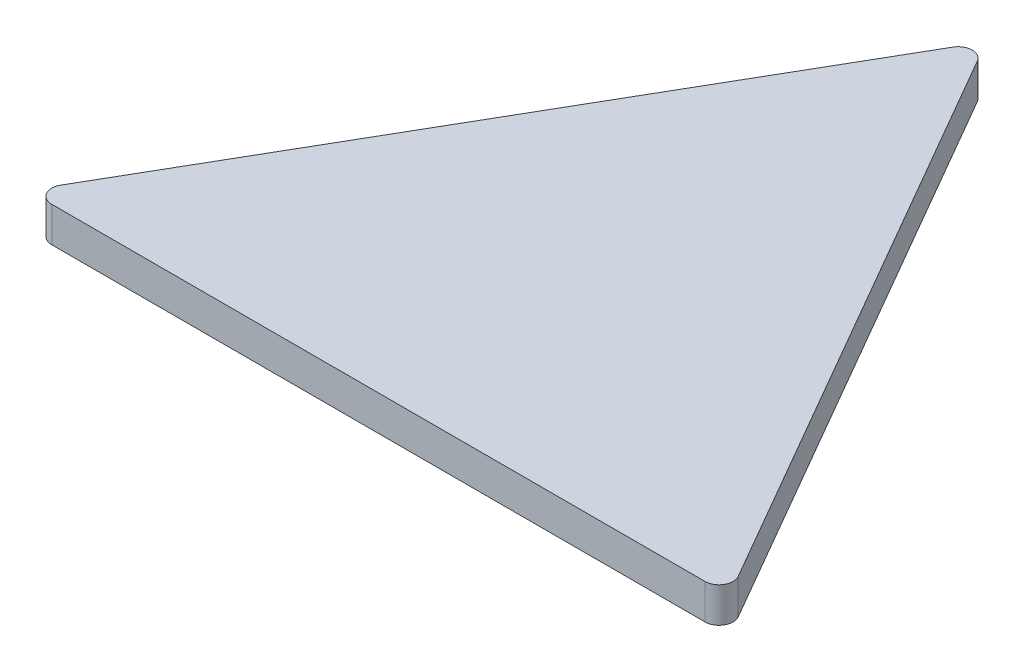
ISO-10303-21;
HEADER;
FILE_DESCRIPTION(('STEP AP214'),'2;1');
FILE_NAME('part.step','',(''),(''),'','','');
FILE_SCHEMA(('AUTOMOTIVE_DESIGN { 1 0 10303 214 1 1 1 1 }'));
ENDSEC;
DATA;
#1=APPLICATION_CONTEXT('core data for automotive mechanical design processes');
#2=APPLICATION_PROTOCOL_DEFINITION('international standard','automotive_design',2000,#1);
#3=PRODUCT_CONTEXT('',#1,'mechanical');
#4=PRODUCT('Part','Part','',(#3));
#5=PRODUCT_RELATED_PRODUCT_CATEGORY('part','',(#4));
#6=PRODUCT_DEFINITION_FORMATION('','',#4);
#7=PRODUCT_DEFINITION_CONTEXT('part definition',#1,'design');
#8=PRODUCT_DEFINITION('design','',#6,#7);
#9=PRODUCT_DEFINITION_SHAPE('','',#8);
#10=(LENGTH_UNIT() NAMED_UNIT(*) SI_UNIT(.MILLI.,.METRE.));
#11=(NAMED_UNIT(*) PLANE_ANGLE_UNIT() SI_UNIT($,.RADIAN.));
#12=(NAMED_UNIT(*) SI_UNIT($,.STERADIAN.) SOLID_ANGLE_UNIT());
#13=UNCERTAINTY_MEASURE_WITH_UNIT(LENGTH_MEASURE(1.E-05),#10,'distance_accuracy_value','');
#14=(GEOMETRIC_REPRESENTATION_CONTEXT(3) GLOBAL_UNCERTAINTY_ASSIGNED_CONTEXT((#13)) GLOBAL_UNIT_ASSIGNED_CONTEXT((#10,
#11,#12)) REPRESENTATION_CONTEXT('',''));
#15=CARTESIAN_POINT('',(0.,0.,0.));
#16=DIRECTION('',(0.,0.,1.));
#17=DIRECTION('',(1.,0.,0.));
#18=AXIS2_PLACEMENT_3D('',#15,#16,#17);
#19=CARTESIAN_POINT('',(127.,12.7,73.3234841870824));
#20=DIRECTION('',(-0.866025403784439,0.,0.5));
#21=DIRECTION('',(0.5,0.,0.866025403784439));
#22=AXIS2_PLACEMENT_3D('',#19,#20,#21);
#23=PLANE('',#22);
#24=DIRECTION('',(-0.5,0.,-0.866025403784439));
#25=VECTOR('',#24,1.);
#26=CARTESIAN_POINT('',(127.,0.,73.3234841870824));
#27=LINE('',#26,#25);
#28=CARTESIAN_POINT('',(122.600590948775,0.,65.7034841870824));
#29=VERTEX_POINT('',#28);
#30=CARTESIAN_POINT('',(4.39940905122493,0.,-139.026968374165));
#31=VERTEX_POINT('',#30);
#32=EDGE_CURVE('E112',#29,#31,#27,.T.);
#33=ORIENTED_EDGE('',*,*,#32,.T.);
#34=DIRECTION('',(0.,-1.,0.));
#35=VECTOR('',#34,1.);
#36=CARTESIAN_POINT('',(4.39940905122495,12.7,-139.026968374165));
#37=LINE('',#36,#35);
#38=CARTESIAN_POINT('',(4.39940905122493,12.7,-139.026968374165));
#39=VERTEX_POINT('',#38);
#40=EDGE_CURVE('E91',#31,#39,#37,.F.);
#41=ORIENTED_EDGE('',*,*,#40,.T.);
#42=DIRECTION('',(-0.5,0.,-0.866025403784439));
#43=VECTOR('',#42,1.);
#44=CARTESIAN_POINT('',(127.,12.7,73.3234841870824));
#45=LINE('',#44,#43);
#46=CARTESIAN_POINT('',(122.600590948775,12.7,65.7034841870824));
#47=VERTEX_POINT('',#46);
#48=EDGE_CURVE('E114',#47,#39,#45,.T.);
#49=ORIENTED_EDGE('',*,*,#48,.F.);
#50=DIRECTION('',(0.,-1.,0.));
#51=VECTOR('',#50,1.);
#52=CARTESIAN_POINT('',(122.600590948775,12.7,65.7034841870824));
#53=LINE('',#52,#51);
#54=EDGE_CURVE('E96',#47,#29,#53,.T.);
#55=ORIENTED_EDGE('',*,*,#54,.T.);
#56=EDGE_LOOP('',(#33,#41,#49,#55));
#57=FACE_BOUND('',#56,.T.);
#58=ADVANCED_FACE('F33',(#57),#23,.F.);
#59=CARTESIAN_POINT('',(0.,12.7,-146.646968374165));
#60=DIRECTION('',(0.866025403784439,0.,0.5));
#61=DIRECTION('',(0.5,0.,-0.866025403784439));
#62=AXIS2_PLACEMENT_3D('',#59,#60,#61);
#63=PLANE('',#62);
#64=DIRECTION('',(-0.5,0.,0.866025403784439));
#65=VECTOR('',#64,1.);
#66=CARTESIAN_POINT('',(0.,12.7,-146.646968374165));
#67=LINE('',#66,#65);
#68=CARTESIAN_POINT('',(-4.39940905122494,12.7,-139.026968374165));
#69=VERTEX_POINT('',#68);
#70=CARTESIAN_POINT('',(-122.600590948775,12.7,65.7034841870825));
#71=VERTEX_POINT('',#70);
#72=EDGE_CURVE('E105',#69,#71,#67,.T.);
#73=ORIENTED_EDGE('',*,*,#72,.F.);
#74=DIRECTION('',(0.,-1.,0.));
#75=VECTOR('',#74,1.);
#76=CARTESIAN_POINT('',(-4.39940905122494,12.7,-139.026968374165));
#77=LINE('',#76,#75);
#78=CARTESIAN_POINT('',(-4.39940905122494,0.,-139.026968374165));
#79=VERTEX_POINT('',#78);
#80=EDGE_CURVE('E90',#69,#79,#77,.T.);
#81=ORIENTED_EDGE('',*,*,#80,.T.);
#82=DIRECTION('',(-0.5,0.,0.866025403784439));
#83=VECTOR('',#82,1.);
#84=CARTESIAN_POINT('',(0.,0.,-146.646968374165));
#85=LINE('',#84,#83);
#86=CARTESIAN_POINT('',(-122.600590948775,0.,65.7034841870825));
#87=VERTEX_POINT('',#86);
#88=EDGE_CURVE('E103',#79,#87,#85,.T.);
#89=ORIENTED_EDGE('',*,*,#88,.T.);
#90=DIRECTION('',(0.,-1.,0.));
#91=VECTOR('',#90,1.);
#92=CARTESIAN_POINT('',(-122.600590948775,12.7,65.7034841870825));
#93=LINE('',#92,#91);
#94=EDGE_CURVE('E107',#87,#71,#93,.F.);
#95=ORIENTED_EDGE('',*,*,#94,.T.);
#96=EDGE_LOOP('',(#73,#81,#89,#95));
#97=FACE_BOUND('',#96,.T.);
#98=ADVANCED_FACE('F102',(#97),#63,.F.);
#99=CARTESIAN_POINT('',(-127.,12.7,73.3234841870825));
#100=DIRECTION('',(0.,0.,-1.));
#101=DIRECTION('',(-1.,0.,0.));
#102=AXIS2_PLACEMENT_3D('',#99,#100,#101);
#103=PLANE('',#102);
#104=DIRECTION('',(1.,0.,0.));
#105=VECTOR('',#104,1.);
#106=CARTESIAN_POINT('',(-127.,0.,73.3234841870825));
#107=LINE('',#106,#105);
#108=CARTESIAN_POINT('',(-118.20118189755,0.,73.3234841870825));
#109=VERTEX_POINT('',#108);
#110=CARTESIAN_POINT('',(118.20118189755,0.,73.3234841870824));
#111=VERTEX_POINT('',#110);
#112=EDGE_CURVE('E111',#109,#111,#107,.T.);
#113=ORIENTED_EDGE('',*,*,#112,.T.);
#114=DIRECTION('',(0.,-1.,0.));
#115=VECTOR('',#114,1.);
#116=CARTESIAN_POINT('',(118.20118189755,12.7,73.3234841870824));
#117=LINE('',#116,#115);
#118=CARTESIAN_POINT('',(118.20118189755,12.7,73.3234841870824));
#119=VERTEX_POINT('',#118);
#120=EDGE_CURVE('E11',#111,#119,#117,.F.);
#121=ORIENTED_EDGE('',*,*,#120,.T.);
#122=DIRECTION('',(1.,0.,0.));
#123=VECTOR('',#122,1.);
#124=CARTESIAN_POINT('',(-127.,12.7,73.3234841870825));
#125=LINE('',#124,#123);
#126=CARTESIAN_POINT('',(-118.20118189755,12.7,73.3234841870825));
#127=VERTEX_POINT('',#126);
#128=EDGE_CURVE('E119',#127,#119,#125,.T.);
#129=ORIENTED_EDGE('',*,*,#128,.F.);
#130=DIRECTION('',(0.,-1.,0.));
#131=VECTOR('',#130,1.);
#132=CARTESIAN_POINT('',(-118.20118189755,12.7,73.3234841870825));
#133=LINE('',#132,#131);
#134=EDGE_CURVE('E41',#127,#109,#133,.T.);
#135=ORIENTED_EDGE('',*,*,#134,.T.);
#136=EDGE_LOOP('',(#113,#121,#129,#135));
#137=FACE_BOUND('',#136,.T.);
#138=ADVANCED_FACE('F132',(#137),#103,.F.);
#139=CARTESIAN_POINT('',(0.,12.7,0.));
#140=DIRECTION('',(0.,1.,0.));
#141=DIRECTION('',(0.,0.,1.));
#142=AXIS2_PLACEMENT_3D('',#139,#140,#141);
#143=PLANE('',#142);
#144=ORIENTED_EDGE('',*,*,#48,.T.);
#145=CARTESIAN_POINT('',(0.,12.7,-136.486968374165));
#146=DIRECTION('',(0.,1.,0.));
#147=DIRECTION('',(0.,0.,1.));
#148=AXIS2_PLACEMENT_3D('',#145,#146,#147);
#149=CIRCLE('',#148,5.08);
#150=EDGE_CURVE('E129',#39,#69,#149,.T.);
#151=ORIENTED_EDGE('',*,*,#150,.T.);
#152=ORIENTED_EDGE('',*,*,#72,.T.);
#153=CARTESIAN_POINT('',(-118.20118189755,12.7,68.2434841870825));
#154=DIRECTION('',(0.,1.,0.));
#155=DIRECTION('',(0.,0.,1.));
#156=AXIS2_PLACEMENT_3D('',#153,#154,#155);
#157=CIRCLE('',#156,5.08);
#158=EDGE_CURVE('E53',#71,#127,#157,.T.);
#159=ORIENTED_EDGE('',*,*,#158,.T.);
#160=ORIENTED_EDGE('',*,*,#128,.T.);
#161=CARTESIAN_POINT('',(118.20118189755,12.7,68.2434841870824));
#162=DIRECTION('',(0.,1.,0.));
#163=DIRECTION('',(0.,0.,1.));
#164=AXIS2_PLACEMENT_3D('',#161,#162,#163);
#165=CIRCLE('',#164,5.08);
#166=EDGE_CURVE('E127',#119,#47,#165,.T.);
#167=ORIENTED_EDGE('',*,*,#166,.T.);
#168=EDGE_LOOP('',(#144,#151,#152,#159,#160,#167));
#169=FACE_BOUND('',#168,.T.);
#170=ADVANCED_FACE('F143',(#169),#143,.T.);
#171=CARTESIAN_POINT('',(0.,0.,0.));
#172=DIRECTION('',(0.,1.,0.));
#173=DIRECTION('',(0.,0.,1.));
#174=AXIS2_PLACEMENT_3D('',#171,#172,#173);
#175=PLANE('',#174);
#176=ORIENTED_EDGE('',*,*,#88,.F.);
#177=CARTESIAN_POINT('',(0.,0.,-136.486968374165));
#178=DIRECTION('',(0.,1.,0.));
#179=DIRECTION('',(0.,0.,1.));
#180=AXIS2_PLACEMENT_3D('',#177,#178,#179);
#181=CIRCLE('',#180,5.08);
#182=EDGE_CURVE('E86',#79,#31,#181,.F.);
#183=ORIENTED_EDGE('',*,*,#182,.T.);
#184=ORIENTED_EDGE('',*,*,#32,.F.);
#185=CARTESIAN_POINT('',(118.20118189755,0.,68.2434841870824));
#186=DIRECTION('',(0.,1.,0.));
#187=DIRECTION('',(0.,0.,1.));
#188=AXIS2_PLACEMENT_3D('',#185,#186,#187);
#189=CIRCLE('',#188,5.08);
#190=EDGE_CURVE('E97',#29,#111,#189,.F.);
#191=ORIENTED_EDGE('',*,*,#190,.T.);
#192=ORIENTED_EDGE('',*,*,#112,.F.);
#193=CARTESIAN_POINT('',(-118.20118189755,0.,68.2434841870825));
#194=DIRECTION('',(0.,1.,0.));
#195=DIRECTION('',(0.,0.,1.));
#196=AXIS2_PLACEMENT_3D('',#193,#194,#195);
#197=CIRCLE('',#196,5.08);
#198=EDGE_CURVE('E106',#109,#87,#197,.F.);
#199=ORIENTED_EDGE('',*,*,#198,.T.);
#200=EDGE_LOOP('',(#176,#183,#184,#191,#192,#199));
#201=FACE_BOUND('',#200,.T.);
#202=ADVANCED_FACE('F109',(#201),#175,.F.);
#203=CARTESIAN_POINT('',(0.,12.7,-136.486968374165));
#204=DIRECTION('',(0.,-1.,0.));
#205=DIRECTION('',(0.,0.,-1.));
#206=AXIS2_PLACEMENT_3D('',#203,#204,#205);
#207=CYLINDRICAL_SURFACE('',#206,5.08);
#208=ORIENTED_EDGE('',*,*,#150,.F.);
#209=ORIENTED_EDGE('',*,*,#40,.F.);
#210=ORIENTED_EDGE('',*,*,#182,.F.);
#211=ORIENTED_EDGE('',*,*,#80,.F.);
#212=EDGE_LOOP('',(#208,#209,#210,#211));
#213=FACE_BOUND('',#212,.T.);
#214=ADVANCED_FACE('F89',(#213),#207,.T.);
#215=CARTESIAN_POINT('',(118.20118189755,12.7,68.2434841870824));
#216=DIRECTION('',(0.,-1.,0.));
#217=DIRECTION('',(0.,0.,-1.));
#218=AXIS2_PLACEMENT_3D('',#215,#216,#217);
#219=CYLINDRICAL_SURFACE('',#218,5.08);
#220=ORIENTED_EDGE('',*,*,#166,.F.);
#221=ORIENTED_EDGE('',*,*,#120,.F.);
#222=ORIENTED_EDGE('',*,*,#190,.F.);
#223=ORIENTED_EDGE('',*,*,#54,.F.);
#224=EDGE_LOOP('',(#220,#221,#222,#223));
#225=FACE_BOUND('',#224,.T.);
#226=ADVANCED_FACE('F137',(#225),#219,.T.);
#227=CARTESIAN_POINT('',(-118.20118189755,12.7,68.2434841870825));
#228=DIRECTION('',(0.,-1.,0.));
#229=DIRECTION('',(0.,0.,-1.));
#230=AXIS2_PLACEMENT_3D('',#227,#228,#229);
#231=CYLINDRICAL_SURFACE('',#230,5.08);
#232=ORIENTED_EDGE('',*,*,#158,.F.);
#233=ORIENTED_EDGE('',*,*,#94,.F.);
#234=ORIENTED_EDGE('',*,*,#198,.F.);
#235=ORIENTED_EDGE('',*,*,#134,.F.);
#236=EDGE_LOOP('',(#232,#233,#234,#235));
#237=FACE_BOUND('',#236,.T.);
#238=ADVANCED_FACE('F35',(#237),#231,.T.);
#239=CLOSED_SHELL('',(#58,#98,#138,#170,#202,#214,#226,#238));
#240=MANIFOLD_SOLID_BREP('B2',#239);
#241=ADVANCED_BREP_SHAPE_REPRESENTATION('',(#18,#240),#14);
#242=SHAPE_DEFINITION_REPRESENTATION(#9,#241);
ENDSEC;
END-ISO-10303-21;
